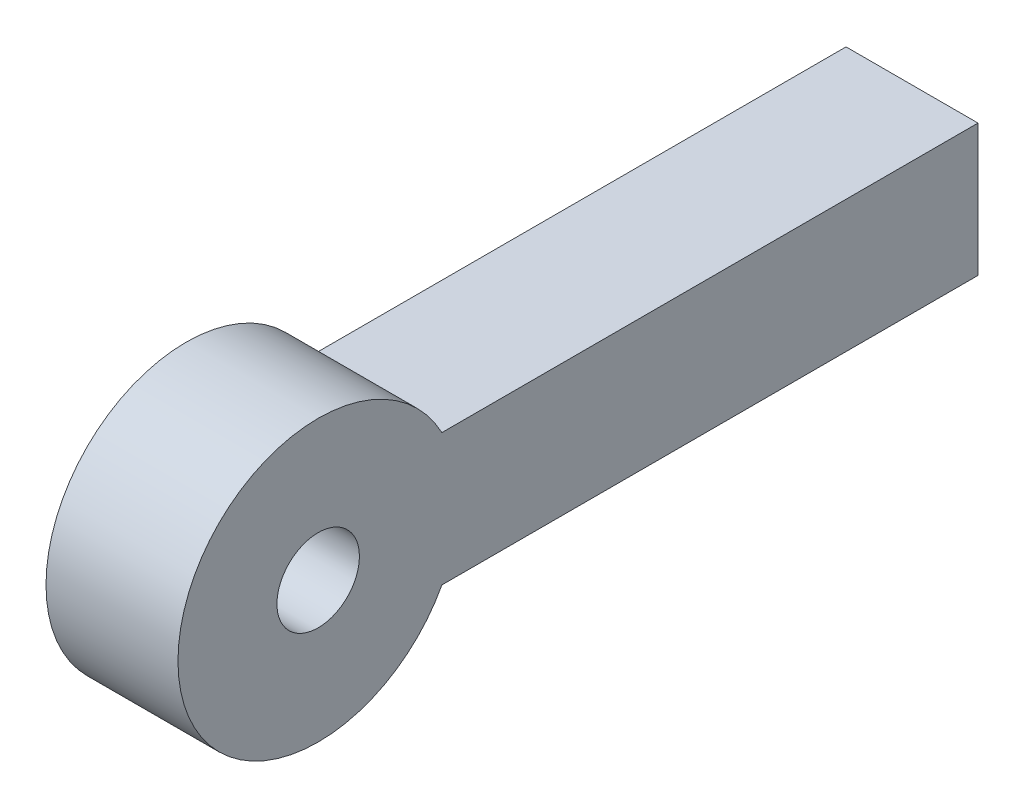
ISO-10303-21;
HEADER;
FILE_DESCRIPTION(('STEP AP214'),'2;1');
FILE_NAME('part.step','',(''),(''),'','','');
FILE_SCHEMA(('AUTOMOTIVE_DESIGN { 1 0 10303 214 1 1 1 1 }'));
ENDSEC;
DATA;
#1=APPLICATION_CONTEXT('core data for automotive mechanical design processes');
#2=APPLICATION_PROTOCOL_DEFINITION('international standard','automotive_design',2000,#1);
#3=PRODUCT_CONTEXT('',#1,'mechanical');
#4=PRODUCT('Part','Part','',(#3));
#5=PRODUCT_RELATED_PRODUCT_CATEGORY('part','',(#4));
#6=PRODUCT_DEFINITION_FORMATION('','',#4);
#7=PRODUCT_DEFINITION_CONTEXT('part definition',#1,'design');
#8=PRODUCT_DEFINITION('design','',#6,#7);
#9=PRODUCT_DEFINITION_SHAPE('','',#8);
#10=(LENGTH_UNIT() NAMED_UNIT(*) SI_UNIT(.MILLI.,.METRE.));
#11=(NAMED_UNIT(*) PLANE_ANGLE_UNIT() SI_UNIT($,.RADIAN.));
#12=(NAMED_UNIT(*) SI_UNIT($,.STERADIAN.) SOLID_ANGLE_UNIT());
#13=UNCERTAINTY_MEASURE_WITH_UNIT(LENGTH_MEASURE(1.E-05),#10,'distance_accuracy_value','');
#14=(GEOMETRIC_REPRESENTATION_CONTEXT(3) GLOBAL_UNCERTAINTY_ASSIGNED_CONTEXT((#13)) GLOBAL_UNIT_ASSIGNED_CONTEXT((#10,
#11,#12)) REPRESENTATION_CONTEXT('',''));
#15=CARTESIAN_POINT('',(0.,0.,0.));
#16=DIRECTION('',(0.,0.,1.));
#17=DIRECTION('',(1.,0.,0.));
#18=AXIS2_PLACEMENT_3D('',#15,#16,#17);
#19=CARTESIAN_POINT('',(1.6,-0.800000000000001,0.));
#20=DIRECTION('',(0.,-1.,0.));
#21=DIRECTION('',(0.,0.,-1.));
#22=AXIS2_PLACEMENT_3D('',#19,#20,#21);
#23=PLANE('',#22);
#24=DIRECTION('',(0.,0.,1.));
#25=VECTOR('',#24,1.);
#26=CARTESIAN_POINT('',(0.,-0.800000000000001,0.));
#27=LINE('',#26,#25);
#28=CARTESIAN_POINT('',(0.,-0.8,-8.));
#29=VERTEX_POINT('',#28);
#30=CARTESIAN_POINT('',(0.,-0.800000000000001,-1.5));
#31=VERTEX_POINT('',#30);
#32=EDGE_CURVE('E119',#29,#31,#27,.T.);
#33=ORIENTED_EDGE('',*,*,#32,.F.);
#34=DIRECTION('',(-1.,0.,0.));
#35=VECTOR('',#34,1.);
#36=CARTESIAN_POINT('',(1.6,-0.8,-8.));
#37=LINE('',#36,#35);
#38=CARTESIAN_POINT('',(1.6,-0.8,-8.));
#39=VERTEX_POINT('',#38);
#40=EDGE_CURVE('E11',#39,#29,#37,.T.);
#41=ORIENTED_EDGE('',*,*,#40,.F.);
#42=DIRECTION('',(0.,0.,1.));
#43=VECTOR('',#42,1.);
#44=CARTESIAN_POINT('',(1.6,-0.800000000000001,0.));
#45=LINE('',#44,#43);
#46=CARTESIAN_POINT('',(1.6,-0.800000000000001,-1.5));
#47=VERTEX_POINT('',#46);
#48=EDGE_CURVE('E106',#39,#47,#45,.T.);
#49=ORIENTED_EDGE('',*,*,#48,.T.);
#50=DIRECTION('',(-1.,0.,0.));
#51=VECTOR('',#50,1.);
#52=CARTESIAN_POINT('',(1.6,-0.800000000000001,-1.5));
#53=LINE('',#52,#51);
#54=EDGE_CURVE('E84',#47,#31,#53,.T.);
#55=ORIENTED_EDGE('',*,*,#54,.T.);
#56=EDGE_LOOP('',(#33,#41,#49,#55));
#57=FACE_BOUND('',#56,.T.);
#58=ADVANCED_FACE('F45',(#57),#23,.T.);
#59=CARTESIAN_POINT('',(1.6,0.,-8.));
#60=DIRECTION('',(0.,0.,-1.));
#61=DIRECTION('',(-1.,0.,0.));
#62=AXIS2_PLACEMENT_3D('',#59,#60,#61);
#63=PLANE('',#62);
#64=DIRECTION('',(0.,-1.,0.));
#65=VECTOR('',#64,1.);
#66=CARTESIAN_POINT('',(0.,0.,-8.));
#67=LINE('',#66,#65);
#68=CARTESIAN_POINT('',(0.,0.8,-8.));
#69=VERTEX_POINT('',#68);
#70=EDGE_CURVE('E97',#69,#29,#67,.T.);
#71=ORIENTED_EDGE('',*,*,#70,.F.);
#72=DIRECTION('',(-1.,0.,0.));
#73=VECTOR('',#72,1.);
#74=CARTESIAN_POINT('',(1.6,0.8,-8.));
#75=LINE('',#74,#73);
#76=CARTESIAN_POINT('',(1.6,0.8,-8.));
#77=VERTEX_POINT('',#76);
#78=EDGE_CURVE('E54',#77,#69,#75,.T.);
#79=ORIENTED_EDGE('',*,*,#78,.F.);
#80=DIRECTION('',(0.,-1.,0.));
#81=VECTOR('',#80,1.);
#82=CARTESIAN_POINT('',(1.6,0.,-8.));
#83=LINE('',#82,#81);
#84=EDGE_CURVE('E95',#77,#39,#83,.T.);
#85=ORIENTED_EDGE('',*,*,#84,.T.);
#86=ORIENTED_EDGE('',*,*,#40,.T.);
#87=EDGE_LOOP('',(#71,#79,#85,#86));
#88=FACE_BOUND('',#87,.T.);
#89=ADVANCED_FACE('F93',(#88),#63,.T.);
#90=CARTESIAN_POINT('',(1.6,0.800000000000001,0.));
#91=DIRECTION('',(0.,-1.,0.));
#92=DIRECTION('',(0.,0.,-1.));
#93=AXIS2_PLACEMENT_3D('',#90,#91,#92);
#94=PLANE('',#93);
#95=DIRECTION('',(0.,0.,1.));
#96=VECTOR('',#95,1.);
#97=CARTESIAN_POINT('',(0.,0.800000000000001,0.));
#98=LINE('',#97,#96);
#99=CARTESIAN_POINT('',(0.,0.800000000000001,-1.5));
#100=VERTEX_POINT('',#99);
#101=EDGE_CURVE('E77',#69,#100,#98,.T.);
#102=ORIENTED_EDGE('',*,*,#101,.T.);
#103=DIRECTION('',(-1.,0.,0.));
#104=VECTOR('',#103,1.);
#105=CARTESIAN_POINT('',(1.6,0.800000000000001,-1.5));
#106=LINE('',#105,#104);
#107=CARTESIAN_POINT('',(1.6,0.800000000000001,-1.5));
#108=VERTEX_POINT('',#107);
#109=EDGE_CURVE('E99',#108,#100,#106,.T.);
#110=ORIENTED_EDGE('',*,*,#109,.F.);
#111=DIRECTION('',(0.,0.,1.));
#112=VECTOR('',#111,1.);
#113=CARTESIAN_POINT('',(1.6,0.800000000000001,0.));
#114=LINE('',#113,#112);
#115=EDGE_CURVE('E100',#77,#108,#114,.T.);
#116=ORIENTED_EDGE('',*,*,#115,.F.);
#117=ORIENTED_EDGE('',*,*,#78,.T.);
#118=EDGE_LOOP('',(#102,#110,#116,#117));
#119=FACE_BOUND('',#118,.T.);
#120=ADVANCED_FACE('F101',(#119),#94,.F.);
#121=CARTESIAN_POINT('',(1.6,0.,0.));
#122=DIRECTION('',(-1.,0.,0.));
#123=DIRECTION('',(0.,0.,1.));
#124=AXIS2_PLACEMENT_3D('',#121,#122,#123);
#125=CYLINDRICAL_SURFACE('',#124,1.7);
#126=CARTESIAN_POINT('',(0.,0.,0.));
#127=DIRECTION('',(1.,0.,0.));
#128=DIRECTION('',(0.,0.,-1.));
#129=AXIS2_PLACEMENT_3D('',#126,#127,#128);
#130=CIRCLE('',#129,1.7);
#131=EDGE_CURVE('E127',#100,#31,#130,.T.);
#132=ORIENTED_EDGE('',*,*,#131,.T.);
#133=ORIENTED_EDGE('',*,*,#54,.F.);
#134=CARTESIAN_POINT('',(1.6,0.,0.));
#135=DIRECTION('',(1.,0.,0.));
#136=DIRECTION('',(0.,0.,-1.));
#137=AXIS2_PLACEMENT_3D('',#134,#135,#136);
#138=CIRCLE('',#137,1.7);
#139=EDGE_CURVE('E62',#108,#47,#138,.T.);
#140=ORIENTED_EDGE('',*,*,#139,.F.);
#141=ORIENTED_EDGE('',*,*,#109,.T.);
#142=EDGE_LOOP('',(#132,#133,#140,#141));
#143=FACE_BOUND('',#142,.T.);
#144=ADVANCED_FACE('F138',(#143),#125,.T.);
#145=CARTESIAN_POINT('',(1.6,0.,0.));
#146=DIRECTION('',(-1.,0.,0.));
#147=DIRECTION('',(0.,0.,1.));
#148=AXIS2_PLACEMENT_3D('',#145,#146,#147);
#149=CYLINDRICAL_SURFACE('',#148,0.5);
#150=CARTESIAN_POINT('',(1.6,0.,0.));
#151=DIRECTION('',(1.,0.,0.));
#152=DIRECTION('',(0.,0.,-1.));
#153=AXIS2_PLACEMENT_3D('',#150,#151,#152);
#154=CIRCLE('',#153,0.5);
#155=CARTESIAN_POINT('',(1.6,0.,-0.5));
#156=VERTEX_POINT('',#155);
#157=EDGE_CURVE('E115',#156,#156,#154,.T.);
#158=ORIENTED_EDGE('',*,*,#157,.T.);
#159=EDGE_LOOP('',(#158));
#160=FACE_BOUND('',#159,.T.);
#161=CARTESIAN_POINT('',(0.,0.,0.));
#162=DIRECTION('',(1.,0.,0.));
#163=DIRECTION('',(0.,0.,-1.));
#164=AXIS2_PLACEMENT_3D('',#161,#162,#163);
#165=CIRCLE('',#164,0.5);
#166=CARTESIAN_POINT('',(0.,0.,-0.5));
#167=VERTEX_POINT('',#166);
#168=EDGE_CURVE('E110',#167,#167,#165,.T.);
#169=ORIENTED_EDGE('',*,*,#168,.F.);
#170=EDGE_LOOP('',(#169));
#171=FACE_BOUND('',#170,.T.);
#172=ADVANCED_FACE('F153',(#160,#171),#149,.F.);
#173=CARTESIAN_POINT('',(1.6,0.,0.));
#174=DIRECTION('',(1.,0.,0.));
#175=DIRECTION('',(0.,0.,-1.));
#176=AXIS2_PLACEMENT_3D('',#173,#174,#175);
#177=PLANE('',#176);
#178=ORIENTED_EDGE('',*,*,#48,.F.);
#179=ORIENTED_EDGE('',*,*,#84,.F.);
#180=ORIENTED_EDGE('',*,*,#115,.T.);
#181=ORIENTED_EDGE('',*,*,#139,.T.);
#182=EDGE_LOOP('',(#178,#179,#180,#181));
#183=FACE_BOUND('',#182,.T.);
#184=ORIENTED_EDGE('',*,*,#157,.F.);
#185=EDGE_LOOP('',(#184));
#186=FACE_BOUND('',#185,.T.);
#187=ADVANCED_FACE('F104',(#183,#186),#177,.T.);
#188=CARTESIAN_POINT('',(0.,0.,0.));
#189=DIRECTION('',(1.,0.,0.));
#190=DIRECTION('',(0.,0.,-1.));
#191=AXIS2_PLACEMENT_3D('',#188,#189,#190);
#192=PLANE('',#191);
#193=ORIENTED_EDGE('',*,*,#32,.T.);
#194=ORIENTED_EDGE('',*,*,#131,.F.);
#195=ORIENTED_EDGE('',*,*,#101,.F.);
#196=ORIENTED_EDGE('',*,*,#70,.T.);
#197=EDGE_LOOP('',(#193,#194,#195,#196));
#198=FACE_BOUND('',#197,.T.);
#199=ORIENTED_EDGE('',*,*,#168,.T.);
#200=EDGE_LOOP('',(#199));
#201=FACE_BOUND('',#200,.T.);
#202=ADVANCED_FACE('F140',(#198,#201),#192,.F.);
#203=CLOSED_SHELL('',(#58,#89,#120,#144,#172,#187,#202));
#204=MANIFOLD_SOLID_BREP('B2',#203);
#205=ADVANCED_BREP_SHAPE_REPRESENTATION('',(#18,#204),#14);
#206=SHAPE_DEFINITION_REPRESENTATION(#9,#205);
ENDSEC;
END-ISO-10303-21;
